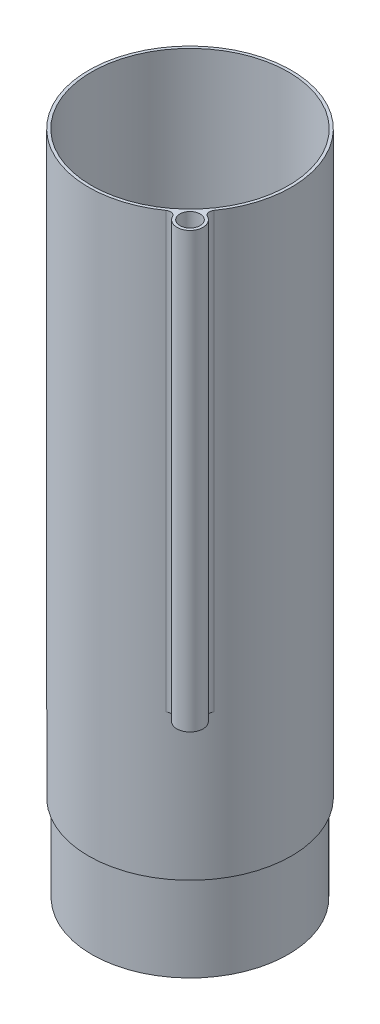
ISO-10303-21;
HEADER;
FILE_DESCRIPTION(('STEP AP214'),'2;1');
FILE_NAME('part.step','',(''),(''),'','','');
FILE_SCHEMA(('AUTOMOTIVE_DESIGN { 1 0 10303 214 1 1 1 1 }'));
ENDSEC;
DATA;
#1=APPLICATION_CONTEXT('core data for automotive mechanical design processes');
#2=APPLICATION_PROTOCOL_DEFINITION('international standard','automotive_design',2000,#1);
#3=PRODUCT_CONTEXT('',#1,'mechanical');
#4=PRODUCT('Part','Part','',(#3));
#5=PRODUCT_RELATED_PRODUCT_CATEGORY('part','',(#4));
#6=PRODUCT_DEFINITION_FORMATION('','',#4);
#7=PRODUCT_DEFINITION_CONTEXT('part definition',#1,'design');
#8=PRODUCT_DEFINITION('design','',#6,#7);
#9=PRODUCT_DEFINITION_SHAPE('','',#8);
#10=(LENGTH_UNIT() NAMED_UNIT(*) SI_UNIT(.MILLI.,.METRE.));
#11=(NAMED_UNIT(*) PLANE_ANGLE_UNIT() SI_UNIT($,.RADIAN.));
#12=(NAMED_UNIT(*) SI_UNIT($,.STERADIAN.) SOLID_ANGLE_UNIT());
#13=UNCERTAINTY_MEASURE_WITH_UNIT(LENGTH_MEASURE(1.E-05),#10,'distance_accuracy_value','');
#14=(GEOMETRIC_REPRESENTATION_CONTEXT(3) GLOBAL_UNCERTAINTY_ASSIGNED_CONTEXT((#13)) GLOBAL_UNIT_ASSIGNED_CONTEXT((#10,
#11,#12)) REPRESENTATION_CONTEXT('',''));
#15=CARTESIAN_POINT('',(0.,0.,0.));
#16=DIRECTION('',(0.,0.,1.));
#17=DIRECTION('',(1.,0.,0.));
#18=AXIS2_PLACEMENT_3D('',#15,#16,#17);
#19=CARTESIAN_POINT('',(0.,200.,0.));
#20=DIRECTION('',(0.,-1.,0.));
#21=DIRECTION('',(0.,0.,-1.));
#22=AXIS2_PLACEMENT_3D('',#19,#20,#21);
#23=CYLINDRICAL_SURFACE('',#22,34.);
#24=CARTESIAN_POINT('',(0.,200.,0.));
#25=DIRECTION('',(0.,1.,0.));
#26=DIRECTION('',(0.,0.,1.));
#27=AXIS2_PLACEMENT_3D('',#24,#25,#26);
#28=CIRCLE('',#27,34.);
#29=CARTESIAN_POINT('',(0.,200.,34.));
#30=VERTEX_POINT('',#29);
#31=EDGE_CURVE('E246',#30,#30,#28,.T.);
#32=ORIENTED_EDGE('',*,*,#31,.T.);
#33=EDGE_LOOP('',(#32));
#34=FACE_BOUND('',#33,.T.);
#35=CARTESIAN_POINT('',(0.,162.,0.));
#36=DIRECTION('',(0.,1.,0.));
#37=DIRECTION('',(0.,0.,1.));
#38=AXIS2_PLACEMENT_3D('',#35,#36,#37);
#39=CIRCLE('',#38,34.);
#40=CARTESIAN_POINT('',(33.5849609375,162.,5.29626272258079));
#41=VERTEX_POINT('',#40);
#42=CARTESIAN_POINT('',(34.,162.,0.));
#43=VERTEX_POINT('',#42);
#44=EDGE_CURVE('E217',#41,#43,#39,.T.);
#45=ORIENTED_EDGE('',*,*,#44,.F.);
#46=DIRECTION('',(0.,-1.,0.));
#47=VECTOR('',#46,1.);
#48=CARTESIAN_POINT('',(33.5849609375,200.,5.29626272258079));
#49=LINE('',#48,#47);
#50=CARTESIAN_POINT('',(33.5849609375,2.,5.29626272258079));
#51=VERTEX_POINT('',#50);
#52=EDGE_CURVE('E263',#41,#51,#49,.T.);
#53=ORIENTED_EDGE('',*,*,#52,.T.);
#54=CARTESIAN_POINT('',(0.,2.,0.));
#55=DIRECTION('',(0.,-1.,0.));
#56=DIRECTION('',(0.,0.,-1.));
#57=AXIS2_PLACEMENT_3D('',#54,#55,#56);
#58=CIRCLE('',#57,34.);
#59=CARTESIAN_POINT('',(33.5849609375,2.,-5.29626272258079));
#60=VERTEX_POINT('',#59);
#61=EDGE_CURVE('E241',#51,#60,#58,.T.);
#62=ORIENTED_EDGE('',*,*,#61,.T.);
#63=DIRECTION('',(0.,-1.,0.));
#64=VECTOR('',#63,1.);
#65=CARTESIAN_POINT('',(33.5849609375,200.,-5.29626272258079));
#66=LINE('',#65,#64);
#67=CARTESIAN_POINT('',(33.5849609375,162.,-5.29626272258079));
#68=VERTEX_POINT('',#67);
#69=EDGE_CURVE('E259',#60,#68,#66,.F.);
#70=ORIENTED_EDGE('',*,*,#69,.T.);
#71=EDGE_CURVE('E211',#43,#68,#39,.T.);
#72=ORIENTED_EDGE('',*,*,#71,.F.);
#73=EDGE_LOOP('',(#45,#53,#62,#70,#72));
#74=FACE_BOUND('',#73,.T.);
#75=ADVANCED_FACE('F39',(#34,#74),#23,.F.);
#76=CARTESIAN_POINT('',(0.,2.,0.));
#77=DIRECTION('',(0.,-1.,0.));
#78=DIRECTION('',(0.,0.,-1.));
#79=AXIS2_PLACEMENT_3D('',#76,#77,#78);
#80=PLANE('',#79);
#81=CARTESIAN_POINT('',(0.,2.,0.));
#82=DIRECTION('',(0.,-1.,0.));
#83=DIRECTION('',(0.,0.,-1.));
#84=AXIS2_PLACEMENT_3D('',#81,#82,#83);
#85=CIRCLE('',#84,32.9);
#86=CARTESIAN_POINT('',(32.85015625,2.,-1.81031332939525));
#87=VERTEX_POINT('',#86);
#88=CARTESIAN_POINT('',(32.85015625,2.,1.81031332939521));
#89=VERTEX_POINT('',#88);
#90=EDGE_CURVE('E242',#87,#89,#85,.T.);
#91=ORIENTED_EDGE('',*,*,#90,.T.);
#92=CARTESIAN_POINT('',(32.,2.,0.));
#93=DIRECTION('',(0.,-1.,0.));
#94=DIRECTION('',(0.,0.,-1.));
#95=AXIS2_PLACEMENT_3D('',#92,#93,#94);
#96=CIRCLE('',#95,2.);
#97=EDGE_CURVE('E231',#89,#87,#96,.F.);
#98=ORIENTED_EDGE('',*,*,#97,.T.);
#99=EDGE_LOOP('',(#91,#98));
#100=FACE_BOUND('',#99,.T.);
#101=ADVANCED_FACE('F342',(#100),#80,.F.);
#102=CARTESIAN_POINT('',(0.,2.,0.));
#103=DIRECTION('',(0.,-1.,0.));
#104=DIRECTION('',(0.,0.,-1.));
#105=AXIS2_PLACEMENT_3D('',#102,#103,#104);
#106=CYLINDRICAL_SURFACE('',#105,32.9);
#107=CARTESIAN_POINT('',(32.731150277932,2.,-3.32893398604277));
#108=VERTEX_POINT('',#107);
#109=EDGE_CURVE('E237',#108,#87,#85,.T.);
#110=ORIENTED_EDGE('',*,*,#109,.F.);
#111=CARTESIAN_POINT('',(32.731150277932,2.,3.32893398604282));
#112=VERTEX_POINT('',#111);
#113=EDGE_CURVE('E236',#112,#108,#85,.T.);
#114=ORIENTED_EDGE('',*,*,#113,.F.);
#115=EDGE_CURVE('E311',#89,#112,#85,.T.);
#116=ORIENTED_EDGE('',*,*,#115,.F.);
#117=ORIENTED_EDGE('',*,*,#90,.F.);
#118=EDGE_LOOP('',(#110,#114,#116,#117));
#119=FACE_BOUND('',#118,.T.);
#120=CARTESIAN_POINT('',(0.,-28.,0.));
#121=DIRECTION('',(0.,-1.,0.));
#122=DIRECTION('',(0.,0.,-1.));
#123=AXIS2_PLACEMENT_3D('',#120,#121,#122);
#124=CIRCLE('',#123,32.9);
#125=CARTESIAN_POINT('',(32.8828042185787,-28.,1.06357262216987));
#126=VERTEX_POINT('',#125);
#127=CARTESIAN_POINT('',(32.8828042185786,-28.,-1.06357262216985));
#128=VERTEX_POINT('',#127);
#129=EDGE_CURVE('E227',#126,#128,#124,.F.);
#130=ORIENTED_EDGE('',*,*,#129,.F.);
#131=EDGE_CURVE('E232',#128,#126,#124,.F.);
#132=ORIENTED_EDGE('',*,*,#131,.F.);
#133=EDGE_LOOP('',(#130,#132));
#134=FACE_BOUND('',#133,.T.);
#135=ADVANCED_FACE('F306',(#119,#134),#106,.F.);
#136=CARTESIAN_POINT('',(0.,0.,0.));
#137=DIRECTION('',(0.,1.,0.));
#138=DIRECTION('',(0.,0.,1.));
#139=AXIS2_PLACEMENT_3D('',#136,#137,#138);
#140=PLANE('',#139);
#141=CARTESIAN_POINT('',(0.,0.,0.));
#142=DIRECTION('',(0.,1.,0.));
#143=DIRECTION('',(0.,0.,1.));
#144=AXIS2_PLACEMENT_3D('',#141,#142,#143);
#145=CIRCLE('',#144,35.);
#146=CARTESIAN_POINT('',(0.,0.,35.));
#147=VERTEX_POINT('',#146);
#148=EDGE_CURVE('E176',#147,#147,#145,.T.);
#149=ORIENTED_EDGE('',*,*,#148,.F.);
#150=EDGE_LOOP('',(#149));
#151=FACE_BOUND('',#150,.T.);
#152=CARTESIAN_POINT('',(0.,0.,0.));
#153=DIRECTION('',(0.,1.,0.));
#154=DIRECTION('',(0.,0.,1.));
#155=AXIS2_PLACEMENT_3D('',#152,#153,#154);
#156=CIRCLE('',#155,33.9);
#157=CARTESIAN_POINT('',(0.,0.,33.9));
#158=VERTEX_POINT('',#157);
#159=EDGE_CURVE('E175',#158,#158,#156,.F.);
#160=ORIENTED_EDGE('',*,*,#159,.F.);
#161=EDGE_LOOP('',(#160));
#162=FACE_BOUND('',#161,.T.);
#163=ADVANCED_FACE('F357',(#151,#162),#140,.F.);
#164=CARTESIAN_POINT('',(0.,200.,0.));
#165=DIRECTION('',(0.,1.,0.));
#166=DIRECTION('',(0.,0.,1.));
#167=AXIS2_PLACEMENT_3D('',#164,#165,#166);
#168=PLANE('',#167);
#169=ORIENTED_EDGE('',*,*,#31,.F.);
#170=EDGE_LOOP('',(#169));
#171=FACE_BOUND('',#170,.T.);
#172=CARTESIAN_POINT('',(0.,200.,0.));
#173=DIRECTION('',(0.,1.,0.));
#174=DIRECTION('',(0.,0.,1.));
#175=AXIS2_PLACEMENT_3D('',#172,#173,#174);
#176=CIRCLE('',#175,35.);
#177=CARTESIAN_POINT('',(28.5338522861947,200.,20.2686771573682));
#178=VERTEX_POINT('',#177);
#179=CARTESIAN_POINT('',(20.2686771573682,200.,28.5338522861947));
#180=VERTEX_POINT('',#179);
#181=EDGE_CURVE('E168',#178,#180,#176,.T.);
#182=ORIENTED_EDGE('',*,*,#181,.T.);
#183=CARTESIAN_POINT('',(21.4268872806464,200.,30.1643581311201));
#184=DIRECTION('',(0.,1.,0.));
#185=DIRECTION('',(0.,0.,1.));
#186=AXIS2_PLACEMENT_3D('',#183,#184,#185);
#187=CIRCLE('',#186,2.);
#188=CARTESIAN_POINT('',(23.2104946021959,200.,29.259512883293));
#189=VERTEX_POINT('',#188);
#190=EDGE_CURVE('E48',#180,#189,#187,.F.);
#191=ORIENTED_EDGE('',*,*,#190,.T.);
#192=CARTESIAN_POINT('',(27.2236110756821,200.,27.2236110756821));
#193=DIRECTION('',(0.,1.,0.));
#194=DIRECTION('',(0.,0.,1.));
#195=AXIS2_PLACEMENT_3D('',#192,#193,#194);
#196=CIRCLE('',#195,4.5);
#197=CARTESIAN_POINT('',(29.259512883293,200.,23.2104946021959));
#198=VERTEX_POINT('',#197);
#199=EDGE_CURVE('E169',#189,#198,#196,.T.);
#200=ORIENTED_EDGE('',*,*,#199,.T.);
#201=CARTESIAN_POINT('',(30.1643581311201,200.,21.4268872806464));
#202=DIRECTION('',(0.,1.,0.));
#203=DIRECTION('',(0.,0.,1.));
#204=AXIS2_PLACEMENT_3D('',#201,#202,#203);
#205=CIRCLE('',#204,2.);
#206=EDGE_CURVE('E161',#198,#178,#205,.F.);
#207=ORIENTED_EDGE('',*,*,#206,.T.);
#208=EDGE_LOOP('',(#182,#191,#200,#207));
#209=FACE_BOUND('',#208,.T.);
#210=CARTESIAN_POINT('',(27.2236110756821,200.,27.2236110756821));
#211=DIRECTION('',(0.,1.,0.));
#212=DIRECTION('',(0.,0.,1.));
#213=AXIS2_PLACEMENT_3D('',#210,#211,#212);
#214=CIRCLE('',#213,3.5);
#215=CARTESIAN_POINT('',(27.2236110756821,200.,30.7236110756821));
#216=VERTEX_POINT('',#215);
#217=EDGE_CURVE('E192',#216,#216,#214,.T.);
#218=ORIENTED_EDGE('',*,*,#217,.F.);
#219=EDGE_LOOP('',(#218));
#220=FACE_BOUND('',#219,.T.);
#221=ADVANCED_FACE('F166',(#171,#209,#220),#168,.T.);
#222=CARTESIAN_POINT('',(0.,200.,0.));
#223=DIRECTION('',(0.,-1.,0.));
#224=DIRECTION('',(0.,0.,-1.));
#225=AXIS2_PLACEMENT_3D('',#222,#223,#224);
#226=CYLINDRICAL_SURFACE('',#225,35.);
#227=ORIENTED_EDGE('',*,*,#181,.F.);
#228=DIRECTION('',(0.,-1.,0.));
#229=VECTOR('',#228,1.);
#230=CARTESIAN_POINT('',(28.5338522861947,200.,20.2686771573682));
#231=LINE('',#230,#229);
#232=CARTESIAN_POINT('',(28.5338522861947,50.,20.2686771573682));
#233=VERTEX_POINT('',#232);
#234=EDGE_CURVE('E144',#178,#233,#231,.T.);
#235=ORIENTED_EDGE('',*,*,#234,.T.);
#236=CARTESIAN_POINT('',(0.,50.,0.));
#237=DIRECTION('',(0.,1.,0.));
#238=DIRECTION('',(0.,0.,1.));
#239=AXIS2_PLACEMENT_3D('',#236,#237,#238);
#240=CIRCLE('',#239,35.);
#241=CARTESIAN_POINT('',(24.7487373415292,50.,24.7487373415292));
#242=VERTEX_POINT('',#241);
#243=EDGE_CURVE('E140',#242,#233,#240,.T.);
#244=ORIENTED_EDGE('',*,*,#243,.F.);
#245=CARTESIAN_POINT('',(20.2686771573682,50.,28.5338522861947));
#246=VERTEX_POINT('',#245);
#247=EDGE_CURVE('E128',#246,#242,#240,.T.);
#248=ORIENTED_EDGE('',*,*,#247,.F.);
#249=DIRECTION('',(0.,-1.,0.));
#250=VECTOR('',#249,1.);
#251=CARTESIAN_POINT('',(20.2686771573682,200.,28.5338522861947));
#252=LINE('',#251,#250);
#253=EDGE_CURVE('E139',#246,#180,#252,.F.);
#254=ORIENTED_EDGE('',*,*,#253,.T.);
#255=EDGE_LOOP('',(#227,#235,#244,#248,#254));
#256=FACE_BOUND('',#255,.T.);
#257=ORIENTED_EDGE('',*,*,#148,.T.);
#258=EDGE_LOOP('',(#257));
#259=FACE_BOUND('',#258,.T.);
#260=ADVANCED_FACE('F172',(#256,#259),#226,.T.);
#261=ORIENTED_EDGE('',*,*,#61,.F.);
#262=CARTESIAN_POINT('',(31.609375,2.,4.98471785654662));
#263=DIRECTION('',(0.,-1.,0.));
#264=DIRECTION('',(0.,0.,-1.));
#265=AXIS2_PLACEMENT_3D('',#262,#263,#264);
#266=CIRCLE('',#265,2.);
#267=EDGE_CURVE('E270',#51,#112,#266,.F.);
#268=ORIENTED_EDGE('',*,*,#267,.T.);
#269=ORIENTED_EDGE('',*,*,#113,.T.);
#270=CARTESIAN_POINT('',(31.609375,2.,-4.98471785654662));
#271=DIRECTION('',(0.,-1.,0.));
#272=DIRECTION('',(0.,0.,-1.));
#273=AXIS2_PLACEMENT_3D('',#270,#271,#272);
#274=CIRCLE('',#273,2.);
#275=EDGE_CURVE('E267',#108,#60,#274,.F.);
#276=ORIENTED_EDGE('',*,*,#275,.T.);
#277=EDGE_LOOP('',(#261,#268,#269,#276));
#278=FACE_BOUND('',#277,.T.);
#279=ADVANCED_FACE('F352',(#278),#80,.F.);
#280=CARTESIAN_POINT('',(0.,-30.,0.));
#281=DIRECTION('',(0.,-1.,0.));
#282=DIRECTION('',(0.,0.,-1.));
#283=AXIS2_PLACEMENT_3D('',#280,#281,#282);
#284=PLANE('',#283);
#285=CARTESIAN_POINT('',(31.1890470702924,-30.,0.));
#286=DIRECTION('',(0.,1.,0.));
#287=DIRECTION('',(0.,0.,1.));
#288=AXIS2_PLACEMENT_3D('',#285,#286,#287);
#289=CIRCLE('',#288,2.);
#290=CARTESIAN_POINT('',(31.1890470702924,-30.,2.));
#291=VERTEX_POINT('',#290);
#292=EDGE_CURVE('E188',#291,#291,#289,.T.);
#293=ORIENTED_EDGE('',*,*,#292,.T.);
#294=EDGE_LOOP('',(#293));
#295=FACE_BOUND('',#294,.T.);
#296=CARTESIAN_POINT('',(0.,-30.,0.));
#297=DIRECTION('',(0.,-1.,0.));
#298=DIRECTION('',(0.,0.,-1.));
#299=AXIS2_PLACEMENT_3D('',#296,#297,#298);
#300=CIRCLE('',#299,5.);
#301=CARTESIAN_POINT('',(0.,-30.,-5.));
#302=VERTEX_POINT('',#301);
#303=EDGE_CURVE('E223',#302,#302,#300,.T.);
#304=ORIENTED_EDGE('',*,*,#303,.F.);
#305=EDGE_LOOP('',(#304));
#306=FACE_BOUND('',#305,.T.);
#307=CARTESIAN_POINT('',(0.,-30.,0.));
#308=DIRECTION('',(0.,-1.,0.));
#309=DIRECTION('',(0.,0.,-1.));
#310=AXIS2_PLACEMENT_3D('',#307,#308,#309);
#311=CIRCLE('',#310,33.9);
#312=CARTESIAN_POINT('',(0.,-30.,-33.9));
#313=VERTEX_POINT('',#312);
#314=EDGE_CURVE('E222',#313,#313,#311,.T.);
#315=ORIENTED_EDGE('',*,*,#314,.T.);
#316=EDGE_LOOP('',(#315));
#317=FACE_BOUND('',#316,.T.);
#318=ADVANCED_FACE('F392',(#295,#306,#317),#284,.T.);
#319=CARTESIAN_POINT('',(0.,-30.,0.));
#320=DIRECTION('',(0.,1.,0.));
#321=DIRECTION('',(0.,0.,1.));
#322=AXIS2_PLACEMENT_3D('',#319,#320,#321);
#323=CYLINDRICAL_SURFACE('',#322,33.9);
#324=ORIENTED_EDGE('',*,*,#314,.F.);
#325=EDGE_LOOP('',(#324));
#326=FACE_BOUND('',#325,.T.);
#327=ORIENTED_EDGE('',*,*,#159,.T.);
#328=EDGE_LOOP('',(#327));
#329=FACE_BOUND('',#328,.T.);
#330=ADVANCED_FACE('F395',(#326,#329),#323,.T.);
#331=CARTESIAN_POINT('',(0.,-28.,0.));
#332=DIRECTION('',(0.,-1.,0.));
#333=DIRECTION('',(0.,0.,-1.));
#334=AXIS2_PLACEMENT_3D('',#331,#332,#333);
#335=PLANE('',#334);
#336=CARTESIAN_POINT('',(0.,-28.,0.));
#337=DIRECTION('',(0.,-1.,0.));
#338=DIRECTION('',(0.,0.,-1.));
#339=AXIS2_PLACEMENT_3D('',#336,#337,#338);
#340=CIRCLE('',#339,5.);
#341=CARTESIAN_POINT('',(0.,-28.,-5.));
#342=VERTEX_POINT('',#341);
#343=EDGE_CURVE('E218',#342,#342,#340,.T.);
#344=ORIENTED_EDGE('',*,*,#343,.T.);
#345=EDGE_LOOP('',(#344));
#346=FACE_BOUND('',#345,.T.);
#347=ORIENTED_EDGE('',*,*,#131,.T.);
#348=CARTESIAN_POINT('',(31.1890470702924,-28.,0.));
#349=DIRECTION('',(0.,-1.,0.));
#350=DIRECTION('',(0.,0.,-1.));
#351=AXIS2_PLACEMENT_3D('',#348,#349,#350);
#352=CIRCLE('',#351,2.);
#353=EDGE_CURVE('E146',#126,#128,#352,.T.);
#354=ORIENTED_EDGE('',*,*,#353,.T.);
#355=EDGE_LOOP('',(#347,#354));
#356=FACE_BOUND('',#355,.T.);
#357=ADVANCED_FACE('F301',(#346,#356),#335,.F.);
#358=CARTESIAN_POINT('',(0.,-28.,0.));
#359=DIRECTION('',(0.,-1.,0.));
#360=DIRECTION('',(0.,0.,-1.));
#361=AXIS2_PLACEMENT_3D('',#358,#359,#360);
#362=CYLINDRICAL_SURFACE('',#361,5.);
#363=ORIENTED_EDGE('',*,*,#343,.F.);
#364=EDGE_LOOP('',(#363));
#365=FACE_BOUND('',#364,.T.);
#366=ORIENTED_EDGE('',*,*,#303,.T.);
#367=EDGE_LOOP('',(#366));
#368=FACE_BOUND('',#367,.T.);
#369=ADVANCED_FACE('F411',(#365,#368),#362,.F.);
#370=CARTESIAN_POINT('',(32.,162.,0.));
#371=DIRECTION('',(0.,1.,0.));
#372=DIRECTION('',(0.,0.,1.));
#373=AXIS2_PLACEMENT_3D('',#370,#371,#372);
#374=PLANE('',#373);
#375=ORIENTED_EDGE('',*,*,#71,.T.);
#376=CARTESIAN_POINT('',(31.609375,162.,-4.98471785654662));
#377=DIRECTION('',(0.,1.,0.));
#378=DIRECTION('',(0.,0.,1.));
#379=AXIS2_PLACEMENT_3D('',#376,#377,#378);
#380=CIRCLE('',#379,2.);
#381=CARTESIAN_POINT('',(31.765625,162.,-2.99083071392799));
#382=VERTEX_POINT('',#381);
#383=EDGE_CURVE('E287',#68,#382,#380,.F.);
#384=ORIENTED_EDGE('',*,*,#383,.T.);
#385=CARTESIAN_POINT('',(32.,162.,0.));
#386=DIRECTION('',(0.,1.,0.));
#387=DIRECTION('',(0.,0.,1.));
#388=AXIS2_PLACEMENT_3D('',#385,#386,#387);
#389=CIRCLE('',#388,3.);
#390=CARTESIAN_POINT('',(31.765625,162.,2.99083071392799));
#391=VERTEX_POINT('',#390);
#392=EDGE_CURVE('E207',#382,#391,#389,.T.);
#393=ORIENTED_EDGE('',*,*,#392,.T.);
#394=CARTESIAN_POINT('',(31.609375,162.,4.98471785654662));
#395=DIRECTION('',(0.,1.,0.));
#396=DIRECTION('',(0.,0.,1.));
#397=AXIS2_PLACEMENT_3D('',#394,#395,#396);
#398=CIRCLE('',#397,2.);
#399=EDGE_CURVE('E283',#391,#41,#398,.F.);
#400=ORIENTED_EDGE('',*,*,#399,.T.);
#401=ORIENTED_EDGE('',*,*,#44,.T.);
#402=CARTESIAN_POINT('',(32.,162.,0.));
#403=DIRECTION('',(0.,1.,0.));
#404=DIRECTION('',(0.,0.,1.));
#405=AXIS2_PLACEMENT_3D('',#402,#403,#404);
#406=CIRCLE('',#405,2.);
#407=EDGE_CURVE('E199',#43,#43,#406,.T.);
#408=ORIENTED_EDGE('',*,*,#407,.F.);
#409=EDGE_LOOP('',(#375,#384,#393,#400,#401,#408));
#410=FACE_BOUND('',#409,.T.);
#411=ADVANCED_FACE('F317',(#410),#374,.T.);
#412=CARTESIAN_POINT('',(32.,2.,0.));
#413=DIRECTION('',(0.,1.,0.));
#414=DIRECTION('',(0.,0.,1.));
#415=AXIS2_PLACEMENT_3D('',#412,#413,#414);
#416=PLANE('',#415);
#417=CARTESIAN_POINT('',(32.,2.,0.));
#418=DIRECTION('',(0.,1.,0.));
#419=DIRECTION('',(0.,0.,1.));
#420=AXIS2_PLACEMENT_3D('',#417,#418,#419);
#421=CIRCLE('',#420,3.);
#422=CARTESIAN_POINT('',(31.765625,2.,-2.99083071392799));
#423=VERTEX_POINT('',#422);
#424=CARTESIAN_POINT('',(31.765625,2.,2.99083071392799));
#425=VERTEX_POINT('',#424);
#426=EDGE_CURVE('E203',#423,#425,#421,.T.);
#427=ORIENTED_EDGE('',*,*,#426,.F.);
#428=CARTESIAN_POINT('',(31.609375,2.,-4.98471785654662));
#429=DIRECTION('',(0.,1.,0.));
#430=DIRECTION('',(0.,0.,1.));
#431=AXIS2_PLACEMENT_3D('',#428,#429,#430);
#432=CIRCLE('',#431,2.);
#433=EDGE_CURVE('E289',#423,#108,#432,.T.);
#434=ORIENTED_EDGE('',*,*,#433,.T.);
#435=ORIENTED_EDGE('',*,*,#109,.T.);
#436=CARTESIAN_POINT('',(32.,2.,0.));
#437=DIRECTION('',(0.,1.,0.));
#438=DIRECTION('',(0.,0.,1.));
#439=AXIS2_PLACEMENT_3D('',#436,#437,#438);
#440=CIRCLE('',#439,2.);
#441=EDGE_CURVE('E197',#87,#89,#440,.T.);
#442=ORIENTED_EDGE('',*,*,#441,.T.);
#443=ORIENTED_EDGE('',*,*,#115,.T.);
#444=CARTESIAN_POINT('',(31.609375,2.,4.98471785654662));
#445=DIRECTION('',(0.,1.,0.));
#446=DIRECTION('',(0.,0.,1.));
#447=AXIS2_PLACEMENT_3D('',#444,#445,#446);
#448=CIRCLE('',#447,2.);
#449=EDGE_CURVE('E280',#112,#425,#448,.T.);
#450=ORIENTED_EDGE('',*,*,#449,.T.);
#451=EDGE_LOOP('',(#427,#434,#435,#442,#443,#450));
#452=FACE_BOUND('',#451,.T.);
#453=ADVANCED_FACE('F336',(#452),#416,.F.);
#454=CARTESIAN_POINT('',(32.,162.,0.));
#455=DIRECTION('',(0.,-1.,0.));
#456=DIRECTION('',(0.,0.,-1.));
#457=AXIS2_PLACEMENT_3D('',#454,#455,#456);
#458=CYLINDRICAL_SURFACE('',#457,3.);
#459=ORIENTED_EDGE('',*,*,#426,.T.);
#460=DIRECTION('',(0.,-1.,0.));
#461=VECTOR('',#460,1.);
#462=CARTESIAN_POINT('',(31.765625,162.,2.99083071392799));
#463=LINE('',#462,#461);
#464=EDGE_CURVE('E277',#425,#391,#463,.F.);
#465=ORIENTED_EDGE('',*,*,#464,.T.);
#466=ORIENTED_EDGE('',*,*,#392,.F.);
#467=DIRECTION('',(0.,-1.,0.));
#468=VECTOR('',#467,1.);
#469=CARTESIAN_POINT('',(31.765625,162.,-2.99083071392799));
#470=LINE('',#469,#468);
#471=EDGE_CURVE('E274',#382,#423,#470,.T.);
#472=ORIENTED_EDGE('',*,*,#471,.T.);
#473=EDGE_LOOP('',(#459,#465,#466,#472));
#474=FACE_BOUND('',#473,.T.);
#475=ADVANCED_FACE('F326',(#474),#458,.T.);
#476=CARTESIAN_POINT('',(32.,162.,0.));
#477=DIRECTION('',(0.,-1.,0.));
#478=DIRECTION('',(0.,0.,-1.));
#479=AXIS2_PLACEMENT_3D('',#476,#477,#478);
#480=CYLINDRICAL_SURFACE('',#479,2.);
#481=ORIENTED_EDGE('',*,*,#97,.F.);
#482=ORIENTED_EDGE('',*,*,#441,.F.);
#483=EDGE_LOOP('',(#481,#482));
#484=FACE_BOUND('',#483,.T.);
#485=ORIENTED_EDGE('',*,*,#407,.T.);
#486=EDGE_LOOP('',(#485));
#487=FACE_BOUND('',#486,.T.);
#488=ADVANCED_FACE('F323',(#484,#487),#480,.F.);
#489=CARTESIAN_POINT('',(31.609375,162.,4.98471785654662));
#490=DIRECTION('',(0.,-1.,0.));
#491=DIRECTION('',(0.,0.,-1.));
#492=AXIS2_PLACEMENT_3D('',#489,#490,#491);
#493=CYLINDRICAL_SURFACE('',#492,2.);
#494=ORIENTED_EDGE('',*,*,#399,.F.);
#495=ORIENTED_EDGE('',*,*,#464,.F.);
#496=ORIENTED_EDGE('',*,*,#449,.F.);
#497=ORIENTED_EDGE('',*,*,#267,.F.);
#498=ORIENTED_EDGE('',*,*,#52,.F.);
#499=EDGE_LOOP('',(#494,#495,#496,#497,#498));
#500=FACE_BOUND('',#499,.T.);
#501=ADVANCED_FACE('F325',(#500),#493,.F.);
#502=CARTESIAN_POINT('',(31.609375,162.,-4.98471785654662));
#503=DIRECTION('',(0.,1.,0.));
#504=DIRECTION('',(0.,0.,1.));
#505=AXIS2_PLACEMENT_3D('',#502,#503,#504);
#506=CYLINDRICAL_SURFACE('',#505,2.);
#507=ORIENTED_EDGE('',*,*,#433,.F.);
#508=ORIENTED_EDGE('',*,*,#471,.F.);
#509=ORIENTED_EDGE('',*,*,#383,.F.);
#510=ORIENTED_EDGE('',*,*,#69,.F.);
#511=ORIENTED_EDGE('',*,*,#275,.F.);
#512=EDGE_LOOP('',(#507,#508,#509,#510,#511));
#513=FACE_BOUND('',#512,.T.);
#514=ADVANCED_FACE('F333',(#513),#506,.F.);
#515=CARTESIAN_POINT('',(31.1890470702924,-28.,0.));
#516=DIRECTION('',(0.,1.,0.));
#517=DIRECTION('',(0.,0.,1.));
#518=AXIS2_PLACEMENT_3D('',#515,#516,#517);
#519=PLANE('',#518);
#520=CARTESIAN_POINT('',(31.1890470702924,-28.,0.));
#521=DIRECTION('',(0.,1.,0.));
#522=DIRECTION('',(0.,0.,1.));
#523=AXIS2_PLACEMENT_3D('',#520,#521,#522);
#524=CIRCLE('',#523,2.);
#525=EDGE_CURVE('E184',#126,#128,#524,.T.);
#526=ORIENTED_EDGE('',*,*,#525,.F.);
#527=ORIENTED_EDGE('',*,*,#129,.T.);
#528=EDGE_LOOP('',(#526,#527));
#529=FACE_BOUND('',#528,.T.);
#530=ADVANCED_FACE('F365',(#529),#519,.F.);
#531=CARTESIAN_POINT('',(31.1890470702924,-30.,0.));
#532=DIRECTION('',(0.,1.,0.));
#533=DIRECTION('',(0.,0.,1.));
#534=AXIS2_PLACEMENT_3D('',#531,#532,#533);
#535=CYLINDRICAL_SURFACE('',#534,2.);
#536=ORIENTED_EDGE('',*,*,#292,.F.);
#537=EDGE_LOOP('',(#536));
#538=FACE_BOUND('',#537,.T.);
#539=ORIENTED_EDGE('',*,*,#525,.T.);
#540=ORIENTED_EDGE('',*,*,#353,.F.);
#541=EDGE_LOOP('',(#539,#540));
#542=FACE_BOUND('',#541,.T.);
#543=ADVANCED_FACE('F384',(#538,#542),#535,.F.);
#544=CARTESIAN_POINT('',(27.2236110756821,50.,27.2236110756821));
#545=DIRECTION('',(0.,1.,0.));
#546=DIRECTION('',(0.,0.,1.));
#547=AXIS2_PLACEMENT_3D('',#544,#545,#546);
#548=CYLINDRICAL_SURFACE('',#547,4.5);
#549=CARTESIAN_POINT('',(27.2236110756821,50.,27.2236110756821));
#550=DIRECTION('',(0.,1.,0.));
#551=DIRECTION('',(0.,0.,1.));
#552=AXIS2_PLACEMENT_3D('',#549,#550,#551);
#553=CIRCLE('',#552,4.5);
#554=CARTESIAN_POINT('',(23.2104946021959,50.,29.259512883293));
#555=VERTEX_POINT('',#554);
#556=CARTESIAN_POINT('',(29.259512883293,50.,23.2104946021959));
#557=VERTEX_POINT('',#556);
#558=EDGE_CURVE('E180',#555,#557,#553,.T.);
#559=ORIENTED_EDGE('',*,*,#558,.T.);
#560=DIRECTION('',(0.,1.,0.));
#561=VECTOR('',#560,1.);
#562=CARTESIAN_POINT('',(29.259512883293,50.,23.2104946021959));
#563=LINE('',#562,#561);
#564=EDGE_CURVE('E55',#557,#198,#563,.T.);
#565=ORIENTED_EDGE('',*,*,#564,.T.);
#566=ORIENTED_EDGE('',*,*,#199,.F.);
#567=DIRECTION('',(0.,1.,0.));
#568=VECTOR('',#567,1.);
#569=CARTESIAN_POINT('',(23.2104946021959,50.,29.259512883293));
#570=LINE('',#569,#568);
#571=EDGE_CURVE('E153',#189,#555,#570,.F.);
#572=ORIENTED_EDGE('',*,*,#571,.T.);
#573=EDGE_LOOP('',(#559,#565,#566,#572));
#574=FACE_BOUND('',#573,.T.);
#575=ADVANCED_FACE('F181',(#574),#548,.T.);
#576=CARTESIAN_POINT('',(27.2236110756821,50.,27.2236110756821));
#577=DIRECTION('',(0.,1.,0.));
#578=DIRECTION('',(0.,0.,1.));
#579=AXIS2_PLACEMENT_3D('',#576,#577,#578);
#580=PLANE('',#579);
#581=ORIENTED_EDGE('',*,*,#558,.F.);
#582=CARTESIAN_POINT('',(21.4268872806464,50.,30.1643581311201));
#583=DIRECTION('',(0.,1.,0.));
#584=DIRECTION('',(0.,0.,1.));
#585=AXIS2_PLACEMENT_3D('',#582,#583,#584);
#586=CIRCLE('',#585,2.);
#587=EDGE_CURVE('E11',#555,#246,#586,.T.);
#588=ORIENTED_EDGE('',*,*,#587,.T.);
#589=ORIENTED_EDGE('',*,*,#247,.T.);
#590=CARTESIAN_POINT('',(27.2236110756821,50.,27.2236110756821));
#591=DIRECTION('',(0.,1.,0.));
#592=DIRECTION('',(0.,0.,1.));
#593=AXIS2_PLACEMENT_3D('',#590,#591,#592);
#594=CIRCLE('',#593,3.5);
#595=EDGE_CURVE('E132',#242,#242,#594,.T.);
#596=ORIENTED_EDGE('',*,*,#595,.T.);
#597=ORIENTED_EDGE('',*,*,#243,.T.);
#598=CARTESIAN_POINT('',(30.1643581311201,50.,21.4268872806464));
#599=DIRECTION('',(0.,1.,0.));
#600=DIRECTION('',(0.,0.,1.));
#601=AXIS2_PLACEMENT_3D('',#598,#599,#600);
#602=CIRCLE('',#601,2.);
#603=EDGE_CURVE('E158',#233,#557,#602,.T.);
#604=ORIENTED_EDGE('',*,*,#603,.T.);
#605=EDGE_LOOP('',(#581,#588,#589,#596,#597,#604));
#606=FACE_BOUND('',#605,.T.);
#607=ADVANCED_FACE('F130',(#606),#580,.F.);
#608=CARTESIAN_POINT('',(27.2236110756821,50.,27.2236110756821));
#609=DIRECTION('',(0.,1.,0.));
#610=DIRECTION('',(0.,0.,1.));
#611=AXIS2_PLACEMENT_3D('',#608,#609,#610);
#612=CYLINDRICAL_SURFACE('',#611,3.5);
#613=ORIENTED_EDGE('',*,*,#217,.T.);
#614=EDGE_LOOP('',(#613));
#615=FACE_BOUND('',#614,.T.);
#616=ORIENTED_EDGE('',*,*,#595,.F.);
#617=EDGE_LOOP('',(#616));
#618=FACE_BOUND('',#617,.T.);
#619=ADVANCED_FACE('F368',(#615,#618),#612,.F.);
#620=CARTESIAN_POINT('',(30.1643581311201,50.,21.4268872806464));
#621=DIRECTION('',(0.,1.,0.));
#622=DIRECTION('',(0.,0.,1.));
#623=AXIS2_PLACEMENT_3D('',#620,#621,#622);
#624=CYLINDRICAL_SURFACE('',#623,2.);
#625=ORIENTED_EDGE('',*,*,#206,.F.);
#626=ORIENTED_EDGE('',*,*,#564,.F.);
#627=ORIENTED_EDGE('',*,*,#603,.F.);
#628=ORIENTED_EDGE('',*,*,#234,.F.);
#629=EDGE_LOOP('',(#625,#626,#627,#628));
#630=FACE_BOUND('',#629,.T.);
#631=ADVANCED_FACE('F179',(#630),#624,.F.);
#632=CARTESIAN_POINT('',(21.4268872806464,50.,30.1643581311201));
#633=DIRECTION('',(0.,-1.,0.));
#634=DIRECTION('',(0.,0.,-1.));
#635=AXIS2_PLACEMENT_3D('',#632,#633,#634);
#636=CYLINDRICAL_SURFACE('',#635,2.);
#637=ORIENTED_EDGE('',*,*,#587,.F.);
#638=ORIENTED_EDGE('',*,*,#571,.F.);
#639=ORIENTED_EDGE('',*,*,#190,.F.);
#640=ORIENTED_EDGE('',*,*,#253,.F.);
#641=EDGE_LOOP('',(#637,#638,#639,#640));
#642=FACE_BOUND('',#641,.T.);
#643=ADVANCED_FACE('F41',(#642),#636,.F.);
#644=CLOSED_SHELL('',(#75,#101,#135,#163,#221,#260,#279,#318,#330,#357,#369,#411,#453,#475,#488,
#501,#514,#530,#543,#575,#607,#619,#631,#643));
#645=MANIFOLD_SOLID_BREP('B2',#644);
#646=ADVANCED_BREP_SHAPE_REPRESENTATION('',(#18,#645),#14);
#647=SHAPE_DEFINITION_REPRESENTATION(#9,#646);
ENDSEC;
END-ISO-10303-21;
